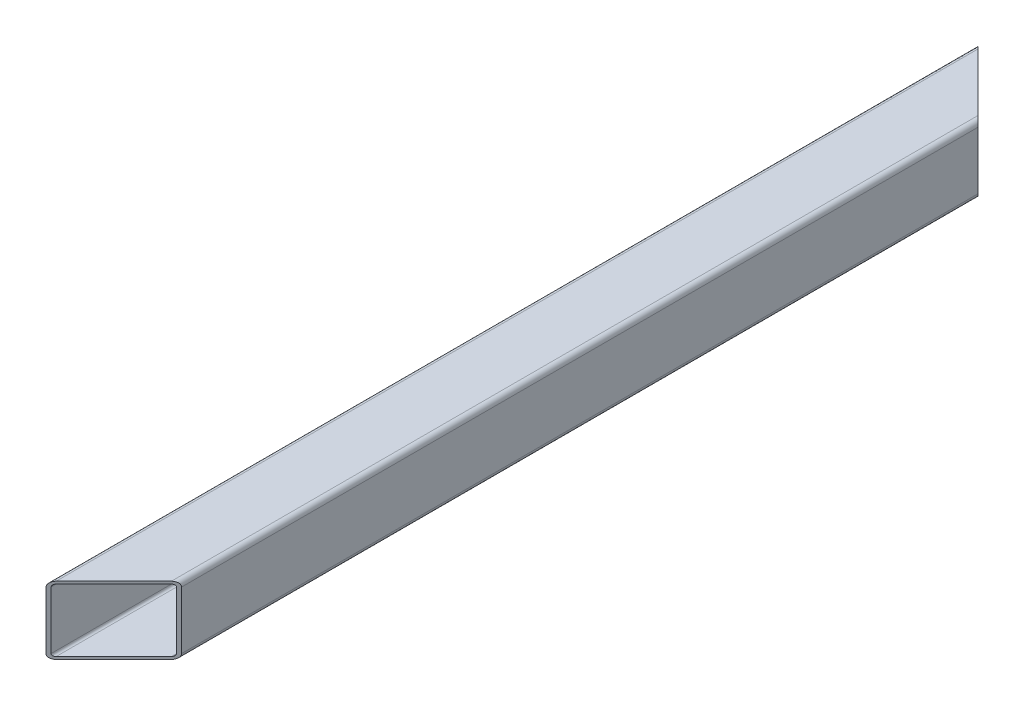
ISO-10303-21;
HEADER;
FILE_DESCRIPTION(('STEP AP214'),'2;1');
FILE_NAME('part.step','',(''),(''),'','','');
FILE_SCHEMA(('AUTOMOTIVE_DESIGN { 1 0 10303 214 1 1 1 1 }'));
ENDSEC;
DATA;
#1=APPLICATION_CONTEXT('core data for automotive mechanical design processes');
#2=APPLICATION_PROTOCOL_DEFINITION('international standard','automotive_design',2000,#1);
#3=PRODUCT_CONTEXT('',#1,'mechanical');
#4=PRODUCT('Part','Part','',(#3));
#5=PRODUCT_RELATED_PRODUCT_CATEGORY('part','',(#4));
#6=PRODUCT_DEFINITION_FORMATION('','',#4);
#7=PRODUCT_DEFINITION_CONTEXT('part definition',#1,'design');
#8=PRODUCT_DEFINITION('design','',#6,#7);
#9=PRODUCT_DEFINITION_SHAPE('','',#8);
#10=(LENGTH_UNIT() NAMED_UNIT(*) SI_UNIT(.MILLI.,.METRE.));
#11=(NAMED_UNIT(*) PLANE_ANGLE_UNIT() SI_UNIT($,.RADIAN.));
#12=(NAMED_UNIT(*) SI_UNIT($,.STERADIAN.) SOLID_ANGLE_UNIT());
#13=UNCERTAINTY_MEASURE_WITH_UNIT(LENGTH_MEASURE(1.E-05),#10,'distance_accuracy_value','');
#14=(GEOMETRIC_REPRESENTATION_CONTEXT(3) GLOBAL_UNCERTAINTY_ASSIGNED_CONTEXT((#13)) GLOBAL_UNIT_ASSIGNED_CONTEXT((#10,
#11,#12)) REPRESENTATION_CONTEXT('',''));
#15=CARTESIAN_POINT('',(0.,0.,0.));
#16=DIRECTION('',(0.,0.,1.));
#17=DIRECTION('',(1.,0.,0.));
#18=AXIS2_PLACEMENT_3D('',#15,#16,#17);
#19=CARTESIAN_POINT('',(34.,34.,550.));
#20=DIRECTION('',(0.,0.,-1.));
#21=DIRECTION('',(-1.,0.,0.));
#22=AXIS2_PLACEMENT_3D('',#19,#20,#21);
#23=CYLINDRICAL_SURFACE('',#22,5.99999999999998);
#24=DIRECTION('',(0.,0.,-1.));
#25=VECTOR('',#24,1.);
#26=CARTESIAN_POINT('',(34.,40.,550.));
#27=LINE('',#26,#25);
#28=CARTESIAN_POINT('',(34.,40.,476.000000000001));
#29=VERTEX_POINT('',#28);
#30=CARTESIAN_POINT('',(34.0000000000001,40.,-476.000000000001));
#31=VERTEX_POINT('',#30);
#32=EDGE_CURVE('E159',#29,#31,#27,.T.);
#33=ORIENTED_EDGE('',*,*,#32,.F.);
#34=CARTESIAN_POINT('',(34.,34.,476.000000000001));
#35=DIRECTION('',(-0.707106781186544,0.,-0.707106781186551));
#36=DIRECTION('',(0.707106781186551,0.,-0.707106781186544));
#37=AXIS2_PLACEMENT_3D('',#34,#35,#36);
#38=ELLIPSE('',#37,8.4852813742385,5.99999999999998);
#39=CARTESIAN_POINT('',(40.,34.,470.000000000001));
#40=VERTEX_POINT('',#39);
#41=EDGE_CURVE('E143',#29,#40,#38,.T.);
#42=ORIENTED_EDGE('',*,*,#41,.T.);
#43=DIRECTION('',(0.,0.,-1.));
#44=VECTOR('',#43,1.);
#45=CARTESIAN_POINT('',(40.,34.,550.));
#46=LINE('',#45,#44);
#47=CARTESIAN_POINT('',(40.,34.,-470.000000000001));
#48=VERTEX_POINT('',#47);
#49=EDGE_CURVE('E182',#40,#48,#46,.T.);
#50=ORIENTED_EDGE('',*,*,#49,.T.);
#51=CARTESIAN_POINT('',(34.,34.,-476.000000000001));
#52=DIRECTION('',(-0.707106781186544,0.,0.707106781186551));
#53=DIRECTION('',(-0.707106781186551,0.,-0.707106781186544));
#54=AXIS2_PLACEMENT_3D('',#51,#52,#53);
#55=ELLIPSE('',#54,8.4852813742385,5.99999999999998);
#56=EDGE_CURVE('E165',#48,#31,#55,.T.);
#57=ORIENTED_EDGE('',*,*,#56,.T.);
#58=EDGE_LOOP('',(#33,#42,#50,#57));
#59=FACE_BOUND('',#58,.T.);
#60=ADVANCED_FACE('F34',(#59),#23,.T.);
#61=CARTESIAN_POINT('',(-34.,40.,550.));
#62=DIRECTION('',(0.,-1.,0.));
#63=DIRECTION('',(0.,0.,-1.));
#64=AXIS2_PLACEMENT_3D('',#61,#62,#63);
#65=PLANE('',#64);
#66=DIRECTION('',(0.,0.,-1.));
#67=VECTOR('',#66,1.);
#68=CARTESIAN_POINT('',(-34.,40.,550.));
#69=LINE('',#68,#67);
#70=CARTESIAN_POINT('',(-34.,40.,544.));
#71=VERTEX_POINT('',#70);
#72=CARTESIAN_POINT('',(-34.,40.,-544.));
#73=VERTEX_POINT('',#72);
#74=EDGE_CURVE('E161',#71,#73,#69,.T.);
#75=ORIENTED_EDGE('',*,*,#74,.F.);
#76=DIRECTION('',(-0.707106781186551,0.,0.707106781186544));
#77=VECTOR('',#76,1.);
#78=CARTESIAN_POINT('',(40.,40.,470.000000000001));
#79=LINE('',#78,#77);
#80=EDGE_CURVE('E146',#29,#71,#79,.T.);
#81=ORIENTED_EDGE('',*,*,#80,.F.);
#82=ORIENTED_EDGE('',*,*,#32,.T.);
#83=DIRECTION('',(0.707106781186551,0.,0.707106781186544));
#84=VECTOR('',#83,1.);
#85=CARTESIAN_POINT('',(40.,40.,-470.000000000001));
#86=LINE('',#85,#84);
#87=EDGE_CURVE('E152',#73,#31,#86,.T.);
#88=ORIENTED_EDGE('',*,*,#87,.F.);
#89=EDGE_LOOP('',(#75,#81,#82,#88));
#90=FACE_BOUND('',#89,.T.);
#91=ADVANCED_FACE('F157',(#90),#65,.F.);
#92=CARTESIAN_POINT('',(-34.,34.,550.));
#93=DIRECTION('',(0.,0.,-1.));
#94=DIRECTION('',(-1.,0.,0.));
#95=AXIS2_PLACEMENT_3D('',#92,#93,#94);
#96=CYLINDRICAL_SURFACE('',#95,5.99999999999998);
#97=DIRECTION('',(0.,0.,-1.));
#98=VECTOR('',#97,1.);
#99=CARTESIAN_POINT('',(-40.,34.,550.));
#100=LINE('',#99,#98);
#101=CARTESIAN_POINT('',(-40.,34.,550.));
#102=VERTEX_POINT('',#101);
#103=CARTESIAN_POINT('',(-40.,34.,-550.));
#104=VERTEX_POINT('',#103);
#105=EDGE_CURVE('E168',#102,#104,#100,.T.);
#106=ORIENTED_EDGE('',*,*,#105,.F.);
#107=CARTESIAN_POINT('',(-34.,34.,544.));
#108=DIRECTION('',(-0.707106781186544,0.,-0.707106781186551));
#109=DIRECTION('',(0.707106781186551,0.,-0.707106781186544));
#110=AXIS2_PLACEMENT_3D('',#107,#108,#109);
#111=ELLIPSE('',#110,8.4852813742385,5.99999999999998);
#112=EDGE_CURVE('E153',#102,#71,#111,.T.);
#113=ORIENTED_EDGE('',*,*,#112,.T.);
#114=ORIENTED_EDGE('',*,*,#74,.T.);
#115=CARTESIAN_POINT('',(-34.,34.,-544.));
#116=DIRECTION('',(-0.707106781186544,0.,0.707106781186551));
#117=DIRECTION('',(-0.707106781186551,0.,-0.707106781186544));
#118=AXIS2_PLACEMENT_3D('',#115,#116,#117);
#119=ELLIPSE('',#118,8.4852813742385,5.99999999999998);
#120=EDGE_CURVE('E206',#73,#104,#119,.T.);
#121=ORIENTED_EDGE('',*,*,#120,.T.);
#122=EDGE_LOOP('',(#106,#113,#114,#121));
#123=FACE_BOUND('',#122,.T.);
#124=ADVANCED_FACE('F317',(#123),#96,.T.);
#125=CARTESIAN_POINT('',(-40.,34.,550.));
#126=DIRECTION('',(1.,0.,0.));
#127=DIRECTION('',(0.,0.,-1.));
#128=AXIS2_PLACEMENT_3D('',#125,#126,#127);
#129=PLANE('',#128);
#130=DIRECTION('',(0.,-1.,0.));
#131=VECTOR('',#130,1.);
#132=CARTESIAN_POINT('',(-40.,34.,-550.));
#133=LINE('',#132,#131);
#134=CARTESIAN_POINT('',(-40.,-34.,-550.));
#135=VERTEX_POINT('',#134);
#136=EDGE_CURVE('E185',#104,#135,#133,.T.);
#137=ORIENTED_EDGE('',*,*,#136,.T.);
#138=DIRECTION('',(0.,0.,-1.));
#139=VECTOR('',#138,1.);
#140=CARTESIAN_POINT('',(-40.,-34.,550.));
#141=LINE('',#140,#139);
#142=CARTESIAN_POINT('',(-40.,-34.,550.));
#143=VERTEX_POINT('',#142);
#144=EDGE_CURVE('E173',#143,#135,#141,.T.);
#145=ORIENTED_EDGE('',*,*,#144,.F.);
#146=DIRECTION('',(0.,-1.,0.));
#147=VECTOR('',#146,1.);
#148=CARTESIAN_POINT('',(-40.,34.,550.));
#149=LINE('',#148,#147);
#150=EDGE_CURVE('E184',#102,#143,#149,.T.);
#151=ORIENTED_EDGE('',*,*,#150,.F.);
#152=ORIENTED_EDGE('',*,*,#105,.T.);
#153=EDGE_LOOP('',(#137,#145,#151,#152));
#154=FACE_BOUND('',#153,.T.);
#155=ADVANCED_FACE('F321',(#154),#129,.F.);
#156=CARTESIAN_POINT('',(-34.,-34.,550.));
#157=DIRECTION('',(0.,0.,-1.));
#158=DIRECTION('',(-1.,0.,0.));
#159=AXIS2_PLACEMENT_3D('',#156,#157,#158);
#160=CYLINDRICAL_SURFACE('',#159,5.99999999999998);
#161=DIRECTION('',(0.,0.,-1.));
#162=VECTOR('',#161,1.);
#163=CARTESIAN_POINT('',(-34.,-40.,550.));
#164=LINE('',#163,#162);
#165=CARTESIAN_POINT('',(-34.,-40.,544.));
#166=VERTEX_POINT('',#165);
#167=CARTESIAN_POINT('',(-34.0000000000001,-40.,-544.));
#168=VERTEX_POINT('',#167);
#169=EDGE_CURVE('E176',#166,#168,#164,.T.);
#170=ORIENTED_EDGE('',*,*,#169,.F.);
#171=CARTESIAN_POINT('',(-34.,-34.,544.));
#172=DIRECTION('',(-0.707106781186544,0.,-0.707106781186551));
#173=DIRECTION('',(0.707106781186551,0.,-0.707106781186544));
#174=AXIS2_PLACEMENT_3D('',#171,#172,#173);
#175=ELLIPSE('',#174,8.4852813742385,5.99999999999998);
#176=EDGE_CURVE('E244',#166,#143,#175,.T.);
#177=ORIENTED_EDGE('',*,*,#176,.T.);
#178=ORIENTED_EDGE('',*,*,#144,.T.);
#179=CARTESIAN_POINT('',(-34.,-34.,-544.));
#180=DIRECTION('',(-0.707106781186544,0.,0.707106781186551));
#181=DIRECTION('',(-0.707106781186551,0.,-0.707106781186544));
#182=AXIS2_PLACEMENT_3D('',#179,#180,#181);
#183=ELLIPSE('',#182,8.4852813742385,5.99999999999998);
#184=EDGE_CURVE('E209',#135,#168,#183,.T.);
#185=ORIENTED_EDGE('',*,*,#184,.T.);
#186=EDGE_LOOP('',(#170,#177,#178,#185));
#187=FACE_BOUND('',#186,.T.);
#188=ADVANCED_FACE('F327',(#187),#160,.T.);
#189=CARTESIAN_POINT('',(-34.,-40.,550.));
#190=DIRECTION('',(0.,1.,0.));
#191=DIRECTION('',(0.,0.,1.));
#192=AXIS2_PLACEMENT_3D('',#189,#190,#191);
#193=PLANE('',#192);
#194=DIRECTION('',(0.,0.,-1.));
#195=VECTOR('',#194,1.);
#196=CARTESIAN_POINT('',(34.,-40.,550.));
#197=LINE('',#196,#195);
#198=CARTESIAN_POINT('',(34.,-40.,476.000000000001));
#199=VERTEX_POINT('',#198);
#200=CARTESIAN_POINT('',(34.,-40.,-476.000000000001));
#201=VERTEX_POINT('',#200);
#202=EDGE_CURVE('E178',#199,#201,#197,.T.);
#203=ORIENTED_EDGE('',*,*,#202,.F.);
#204=DIRECTION('',(-0.707106781186551,0.,0.707106781186544));
#205=VECTOR('',#204,1.);
#206=CARTESIAN_POINT('',(-37.,-40.,547.));
#207=LINE('',#206,#205);
#208=EDGE_CURVE('E247',#199,#166,#207,.T.);
#209=ORIENTED_EDGE('',*,*,#208,.T.);
#210=ORIENTED_EDGE('',*,*,#169,.T.);
#211=DIRECTION('',(0.707106781186551,0.,0.707106781186544));
#212=VECTOR('',#211,1.);
#213=CARTESIAN_POINT('',(513.,-40.,2.99999999999423));
#214=LINE('',#213,#212);
#215=EDGE_CURVE('E212',#168,#201,#214,.T.);
#216=ORIENTED_EDGE('',*,*,#215,.T.);
#217=EDGE_LOOP('',(#203,#209,#210,#216));
#218=FACE_BOUND('',#217,.T.);
#219=ADVANCED_FACE('F331',(#218),#193,.F.);
#220=CARTESIAN_POINT('',(34.,-34.,550.));
#221=DIRECTION('',(0.,0.,-1.));
#222=DIRECTION('',(-1.,0.,0.));
#223=AXIS2_PLACEMENT_3D('',#220,#221,#222);
#224=CYLINDRICAL_SURFACE('',#223,5.99999999999998);
#225=DIRECTION('',(0.,0.,-1.));
#226=VECTOR('',#225,1.);
#227=CARTESIAN_POINT('',(40.,-34.,550.));
#228=LINE('',#227,#226);
#229=CARTESIAN_POINT('',(40.,-34.,470.000000000001));
#230=VERTEX_POINT('',#229);
#231=CARTESIAN_POINT('',(40.,-34.,-470.000000000001));
#232=VERTEX_POINT('',#231);
#233=EDGE_CURVE('E180',#230,#232,#228,.T.);
#234=ORIENTED_EDGE('',*,*,#233,.F.);
#235=CARTESIAN_POINT('',(34.,-34.,476.000000000001));
#236=DIRECTION('',(-0.707106781186544,0.,-0.707106781186551));
#237=DIRECTION('',(0.707106781186551,0.,-0.707106781186544));
#238=AXIS2_PLACEMENT_3D('',#235,#236,#237);
#239=ELLIPSE('',#238,8.4852813742385,5.99999999999998);
#240=EDGE_CURVE('E48',#230,#199,#239,.T.);
#241=ORIENTED_EDGE('',*,*,#240,.T.);
#242=ORIENTED_EDGE('',*,*,#202,.T.);
#243=CARTESIAN_POINT('',(34.,-34.,-476.000000000001));
#244=DIRECTION('',(-0.707106781186544,0.,0.707106781186551));
#245=DIRECTION('',(-0.707106781186551,0.,-0.707106781186544));
#246=AXIS2_PLACEMENT_3D('',#243,#244,#245);
#247=ELLIPSE('',#246,8.4852813742385,5.99999999999998);
#248=EDGE_CURVE('E215',#201,#232,#247,.T.);
#249=ORIENTED_EDGE('',*,*,#248,.T.);
#250=EDGE_LOOP('',(#234,#241,#242,#249));
#251=FACE_BOUND('',#250,.T.);
#252=ADVANCED_FACE('F335',(#251),#224,.T.);
#253=CARTESIAN_POINT('',(40.,34.,550.));
#254=DIRECTION('',(-1.,0.,0.));
#255=DIRECTION('',(0.,0.,1.));
#256=AXIS2_PLACEMENT_3D('',#253,#254,#255);
#257=PLANE('',#256);
#258=ORIENTED_EDGE('',*,*,#49,.F.);
#259=DIRECTION('',(0.,1.,0.));
#260=VECTOR('',#259,1.);
#261=CARTESIAN_POINT('',(40.,-100.,470.000000000001));
#262=LINE('',#261,#260);
#263=EDGE_CURVE('E148',#230,#40,#262,.T.);
#264=ORIENTED_EDGE('',*,*,#263,.F.);
#265=ORIENTED_EDGE('',*,*,#233,.T.);
#266=DIRECTION('',(0.,1.,0.));
#267=VECTOR('',#266,1.);
#268=CARTESIAN_POINT('',(40.,-100.,-470.000000000001));
#269=LINE('',#268,#267);
#270=EDGE_CURVE('E239',#232,#48,#269,.T.);
#271=ORIENTED_EDGE('',*,*,#270,.T.);
#272=EDGE_LOOP('',(#258,#264,#265,#271));
#273=FACE_BOUND('',#272,.T.);
#274=ADVANCED_FACE('F339',(#273),#257,.F.);
#275=CARTESIAN_POINT('',(-34.,34.,550.));
#276=DIRECTION('',(0.,0.,-1.));
#277=DIRECTION('',(-1.,0.,0.));
#278=AXIS2_PLACEMENT_3D('',#275,#276,#277);
#279=CYLINDRICAL_SURFACE('',#278,3.);
#280=CARTESIAN_POINT('',(-34.,34.,544.));
#281=DIRECTION('',(-0.707106781186544,0.,-0.707106781186551));
#282=DIRECTION('',(0.707106781186551,0.,-0.707106781186544));
#283=AXIS2_PLACEMENT_3D('',#280,#281,#282);
#284=ELLIPSE('',#283,4.24264068711926,3.);
#285=CARTESIAN_POINT('',(-37.,34.,547.));
#286=VERTEX_POINT('',#285);
#287=CARTESIAN_POINT('',(-34.,37.,544.));
#288=VERTEX_POINT('',#287);
#289=EDGE_CURVE('E55',#286,#288,#284,.T.);
#290=ORIENTED_EDGE('',*,*,#289,.F.);
#291=DIRECTION('',(0.,0.,-1.));
#292=VECTOR('',#291,1.);
#293=CARTESIAN_POINT('',(-37.,34.,550.));
#294=LINE('',#293,#292);
#295=CARTESIAN_POINT('',(-37.,34.,-547.));
#296=VERTEX_POINT('',#295);
#297=EDGE_CURVE('E188',#286,#296,#294,.T.);
#298=ORIENTED_EDGE('',*,*,#297,.T.);
#299=CARTESIAN_POINT('',(-34.,34.,-544.));
#300=DIRECTION('',(-0.707106781186544,0.,0.707106781186551));
#301=DIRECTION('',(-0.707106781186551,0.,-0.707106781186544));
#302=AXIS2_PLACEMENT_3D('',#299,#300,#301);
#303=ELLIPSE('',#302,4.24264068711926,3.);
#304=CARTESIAN_POINT('',(-34.0000000000001,37.,-544.));
#305=VERTEX_POINT('',#304);
#306=EDGE_CURVE('E218',#305,#296,#303,.T.);
#307=ORIENTED_EDGE('',*,*,#306,.F.);
#308=DIRECTION('',(0.,0.,-1.));
#309=VECTOR('',#308,1.);
#310=CARTESIAN_POINT('',(-34.,37.,550.));
#311=LINE('',#310,#309);
#312=EDGE_CURVE('E203',#288,#305,#311,.T.);
#313=ORIENTED_EDGE('',*,*,#312,.F.);
#314=EDGE_LOOP('',(#290,#298,#307,#313));
#315=FACE_BOUND('',#314,.T.);
#316=ADVANCED_FACE('F285',(#315),#279,.F.);
#317=CARTESIAN_POINT('',(-37.,34.,550.));
#318=DIRECTION('',(1.,0.,0.));
#319=DIRECTION('',(0.,1.,0.));
#320=AXIS2_PLACEMENT_3D('',#317,#318,#319);
#321=PLANE('',#320);
#322=DIRECTION('',(0.,1.,0.));
#323=VECTOR('',#322,1.);
#324=CARTESIAN_POINT('',(-37.,34.,547.));
#325=LINE('',#324,#323);
#326=CARTESIAN_POINT('',(-37.,-34.,547.));
#327=VERTEX_POINT('',#326);
#328=EDGE_CURVE('E252',#327,#286,#325,.T.);
#329=ORIENTED_EDGE('',*,*,#328,.F.);
#330=DIRECTION('',(0.,0.,-1.));
#331=VECTOR('',#330,1.);
#332=CARTESIAN_POINT('',(-37.,-34.,550.));
#333=LINE('',#332,#331);
#334=CARTESIAN_POINT('',(-37.,-34.,-547.));
#335=VERTEX_POINT('',#334);
#336=EDGE_CURVE('E191',#327,#335,#333,.T.);
#337=ORIENTED_EDGE('',*,*,#336,.T.);
#338=DIRECTION('',(0.,-1.,0.));
#339=VECTOR('',#338,1.);
#340=CARTESIAN_POINT('',(-37.,34.0000000000001,-547.));
#341=LINE('',#340,#339);
#342=EDGE_CURVE('E221',#296,#335,#341,.T.);
#343=ORIENTED_EDGE('',*,*,#342,.F.);
#344=ORIENTED_EDGE('',*,*,#297,.F.);
#345=EDGE_LOOP('',(#329,#337,#343,#344));
#346=FACE_BOUND('',#345,.T.);
#347=ADVANCED_FACE('F291',(#346),#321,.T.);
#348=CARTESIAN_POINT('',(-34.,-34.,550.));
#349=DIRECTION('',(0.,0.,-1.));
#350=DIRECTION('',(-1.,0.,0.));
#351=AXIS2_PLACEMENT_3D('',#348,#349,#350);
#352=CYLINDRICAL_SURFACE('',#351,3.);
#353=CARTESIAN_POINT('',(-34.,-34.,544.));
#354=DIRECTION('',(-0.707106781186544,0.,-0.707106781186551));
#355=DIRECTION('',(0.707106781186551,0.,-0.707106781186544));
#356=AXIS2_PLACEMENT_3D('',#353,#354,#355);
#357=ELLIPSE('',#356,4.24264068711927,3.);
#358=CARTESIAN_POINT('',(-34.,-37.,544.));
#359=VERTEX_POINT('',#358);
#360=EDGE_CURVE('E254',#359,#327,#357,.T.);
#361=ORIENTED_EDGE('',*,*,#360,.F.);
#362=DIRECTION('',(0.,0.,-1.));
#363=VECTOR('',#362,1.);
#364=CARTESIAN_POINT('',(-34.,-37.,550.));
#365=LINE('',#364,#363);
#366=CARTESIAN_POINT('',(-34.0000000000001,-37.,-544.));
#367=VERTEX_POINT('',#366);
#368=EDGE_CURVE('E193',#359,#367,#365,.T.);
#369=ORIENTED_EDGE('',*,*,#368,.T.);
#370=CARTESIAN_POINT('',(-34.,-34.,-544.));
#371=DIRECTION('',(-0.707106781186544,0.,0.707106781186551));
#372=DIRECTION('',(-0.707106781186551,0.,-0.707106781186544));
#373=AXIS2_PLACEMENT_3D('',#370,#371,#372);
#374=ELLIPSE('',#373,4.24264068711927,3.);
#375=EDGE_CURVE('E224',#335,#367,#374,.T.);
#376=ORIENTED_EDGE('',*,*,#375,.F.);
#377=ORIENTED_EDGE('',*,*,#336,.F.);
#378=EDGE_LOOP('',(#361,#369,#376,#377));
#379=FACE_BOUND('',#378,.T.);
#380=ADVANCED_FACE('F295',(#379),#352,.F.);
#381=CARTESIAN_POINT('',(-34.,-37.,550.));
#382=DIRECTION('',(0.,1.,0.));
#383=DIRECTION('',(-1.,0.,0.));
#384=AXIS2_PLACEMENT_3D('',#381,#382,#383);
#385=PLANE('',#384);
#386=DIRECTION('',(-0.707106781186551,0.,0.707106781186544));
#387=VECTOR('',#386,1.);
#388=CARTESIAN_POINT('',(-37.,-37.,547.));
#389=LINE('',#388,#387);
#390=CARTESIAN_POINT('',(34.,-37.,476.000000000001));
#391=VERTEX_POINT('',#390);
#392=EDGE_CURVE('E256',#391,#359,#389,.T.);
#393=ORIENTED_EDGE('',*,*,#392,.F.);
#394=DIRECTION('',(0.,0.,-1.));
#395=VECTOR('',#394,1.);
#396=CARTESIAN_POINT('',(34.,-37.,550.));
#397=LINE('',#396,#395);
#398=CARTESIAN_POINT('',(34.,-37.,-476.000000000001));
#399=VERTEX_POINT('',#398);
#400=EDGE_CURVE('E195',#391,#399,#397,.T.);
#401=ORIENTED_EDGE('',*,*,#400,.T.);
#402=DIRECTION('',(0.707106781186551,0.,0.707106781186544));
#403=VECTOR('',#402,1.);
#404=CARTESIAN_POINT('',(513.,-37.,2.99999999999423));
#405=LINE('',#404,#403);
#406=EDGE_CURVE('E227',#367,#399,#405,.T.);
#407=ORIENTED_EDGE('',*,*,#406,.F.);
#408=ORIENTED_EDGE('',*,*,#368,.F.);
#409=EDGE_LOOP('',(#393,#401,#407,#408));
#410=FACE_BOUND('',#409,.T.);
#411=ADVANCED_FACE('F301',(#410),#385,.T.);
#412=CARTESIAN_POINT('',(34.,-34.,550.));
#413=DIRECTION('',(0.,0.,-1.));
#414=DIRECTION('',(-1.,0.,0.));
#415=AXIS2_PLACEMENT_3D('',#412,#413,#414);
#416=CYLINDRICAL_SURFACE('',#415,3.);
#417=CARTESIAN_POINT('',(34.,-34.,476.000000000001));
#418=DIRECTION('',(-0.707106781186544,0.,-0.707106781186551));
#419=DIRECTION('',(0.707106781186551,0.,-0.707106781186544));
#420=AXIS2_PLACEMENT_3D('',#417,#418,#419);
#421=ELLIPSE('',#420,4.24264068711926,3.);
#422=CARTESIAN_POINT('',(37.,-34.,473.000000000001));
#423=VERTEX_POINT('',#422);
#424=EDGE_CURVE('E258',#423,#391,#421,.T.);
#425=ORIENTED_EDGE('',*,*,#424,.F.);
#426=DIRECTION('',(0.,0.,-1.));
#427=VECTOR('',#426,1.);
#428=CARTESIAN_POINT('',(37.,-34.,550.));
#429=LINE('',#428,#427);
#430=CARTESIAN_POINT('',(37.,-34.,-473.000000000001));
#431=VERTEX_POINT('',#430);
#432=EDGE_CURVE('E197',#423,#431,#429,.T.);
#433=ORIENTED_EDGE('',*,*,#432,.T.);
#434=CARTESIAN_POINT('',(34.,-34.,-476.000000000001));
#435=DIRECTION('',(-0.707106781186544,0.,0.707106781186551));
#436=DIRECTION('',(-0.707106781186551,0.,-0.707106781186544));
#437=AXIS2_PLACEMENT_3D('',#434,#435,#436);
#438=ELLIPSE('',#437,4.24264068711926,3.);
#439=EDGE_CURVE('E230',#399,#431,#438,.T.);
#440=ORIENTED_EDGE('',*,*,#439,.F.);
#441=ORIENTED_EDGE('',*,*,#400,.F.);
#442=EDGE_LOOP('',(#425,#433,#440,#441));
#443=FACE_BOUND('',#442,.T.);
#444=ADVANCED_FACE('F304',(#443),#416,.F.);
#445=CARTESIAN_POINT('',(37.,34.,550.));
#446=DIRECTION('',(-1.,0.,0.));
#447=DIRECTION('',(0.,-1.,0.));
#448=AXIS2_PLACEMENT_3D('',#445,#446,#447);
#449=PLANE('',#448);
#450=DIRECTION('',(0.,-1.,0.));
#451=VECTOR('',#450,1.);
#452=CARTESIAN_POINT('',(37.,34.,473.000000000001));
#453=LINE('',#452,#451);
#454=CARTESIAN_POINT('',(37.,34.,473.000000000001));
#455=VERTEX_POINT('',#454);
#456=EDGE_CURVE('E260',#455,#423,#453,.T.);
#457=ORIENTED_EDGE('',*,*,#456,.F.);
#458=DIRECTION('',(0.,0.,-1.));
#459=VECTOR('',#458,1.);
#460=CARTESIAN_POINT('',(37.,34.,550.));
#461=LINE('',#460,#459);
#462=CARTESIAN_POINT('',(37.,34.,-473.000000000001));
#463=VERTEX_POINT('',#462);
#464=EDGE_CURVE('E199',#455,#463,#461,.T.);
#465=ORIENTED_EDGE('',*,*,#464,.T.);
#466=DIRECTION('',(0.,1.,0.));
#467=VECTOR('',#466,1.);
#468=CARTESIAN_POINT('',(37.,33.9999999999999,-473.000000000001));
#469=LINE('',#468,#467);
#470=EDGE_CURVE('E233',#431,#463,#469,.T.);
#471=ORIENTED_EDGE('',*,*,#470,.F.);
#472=ORIENTED_EDGE('',*,*,#432,.F.);
#473=EDGE_LOOP('',(#457,#465,#471,#472));
#474=FACE_BOUND('',#473,.T.);
#475=ADVANCED_FACE('F272',(#474),#449,.T.);
#476=CARTESIAN_POINT('',(34.,34.,550.));
#477=DIRECTION('',(0.,0.,-1.));
#478=DIRECTION('',(-1.,0.,0.));
#479=AXIS2_PLACEMENT_3D('',#476,#477,#478);
#480=CYLINDRICAL_SURFACE('',#479,3.);
#481=CARTESIAN_POINT('',(34.,34.,476.000000000001));
#482=DIRECTION('',(-0.707106781186544,0.,-0.707106781186551));
#483=DIRECTION('',(0.707106781186551,0.,-0.707106781186544));
#484=AXIS2_PLACEMENT_3D('',#481,#482,#483);
#485=ELLIPSE('',#484,4.24264068711926,3.);
#486=CARTESIAN_POINT('',(34.,37.,476.000000000001));
#487=VERTEX_POINT('',#486);
#488=EDGE_CURVE('E262',#487,#455,#485,.T.);
#489=ORIENTED_EDGE('',*,*,#488,.F.);
#490=DIRECTION('',(0.,0.,-1.));
#491=VECTOR('',#490,1.);
#492=CARTESIAN_POINT('',(34.,37.,550.));
#493=LINE('',#492,#491);
#494=CARTESIAN_POINT('',(34.,37.,-476.000000000001));
#495=VERTEX_POINT('',#494);
#496=EDGE_CURVE('E201',#487,#495,#493,.T.);
#497=ORIENTED_EDGE('',*,*,#496,.T.);
#498=CARTESIAN_POINT('',(34.,34.,-476.000000000001));
#499=DIRECTION('',(-0.707106781186544,0.,0.707106781186551));
#500=DIRECTION('',(-0.707106781186551,0.,-0.707106781186544));
#501=AXIS2_PLACEMENT_3D('',#498,#499,#500);
#502=ELLIPSE('',#501,4.24264068711926,3.);
#503=EDGE_CURVE('E236',#463,#495,#502,.T.);
#504=ORIENTED_EDGE('',*,*,#503,.F.);
#505=ORIENTED_EDGE('',*,*,#464,.F.);
#506=EDGE_LOOP('',(#489,#497,#504,#505));
#507=FACE_BOUND('',#506,.T.);
#508=ADVANCED_FACE('F275',(#507),#480,.F.);
#509=CARTESIAN_POINT('',(-34.,37.,550.));
#510=DIRECTION('',(0.,-1.,0.));
#511=DIRECTION('',(1.,0.,0.));
#512=AXIS2_PLACEMENT_3D('',#509,#510,#511);
#513=PLANE('',#512);
#514=DIRECTION('',(0.707106781186551,0.,-0.707106781186544));
#515=VECTOR('',#514,1.);
#516=CARTESIAN_POINT('',(-37.,37.,547.));
#517=LINE('',#516,#515);
#518=EDGE_CURVE('E11',#288,#487,#517,.T.);
#519=ORIENTED_EDGE('',*,*,#518,.F.);
#520=ORIENTED_EDGE('',*,*,#312,.T.);
#521=DIRECTION('',(-0.707106781186551,0.,-0.707106781186544));
#522=VECTOR('',#521,1.);
#523=CARTESIAN_POINT('',(513.,37.0000000000001,2.99999999999423));
#524=LINE('',#523,#522);
#525=EDGE_CURVE('E41',#495,#305,#524,.T.);
#526=ORIENTED_EDGE('',*,*,#525,.F.);
#527=ORIENTED_EDGE('',*,*,#496,.F.);
#528=EDGE_LOOP('',(#519,#520,#526,#527));
#529=FACE_BOUND('',#528,.T.);
#530=ADVANCED_FACE('F282',(#529),#513,.T.);
#531=CARTESIAN_POINT('',(40.,-100.,-470.000000000001));
#532=DIRECTION('',(-0.707106781186544,0.,0.707106781186551));
#533=DIRECTION('',(0.707106781186551,0.,0.707106781186544));
#534=AXIS2_PLACEMENT_3D('',#531,#532,#533);
#535=PLANE('',#534);
#536=ORIENTED_EDGE('',*,*,#306,.T.);
#537=ORIENTED_EDGE('',*,*,#342,.T.);
#538=ORIENTED_EDGE('',*,*,#375,.T.);
#539=ORIENTED_EDGE('',*,*,#406,.T.);
#540=ORIENTED_EDGE('',*,*,#439,.T.);
#541=ORIENTED_EDGE('',*,*,#470,.T.);
#542=ORIENTED_EDGE('',*,*,#503,.T.);
#543=ORIENTED_EDGE('',*,*,#525,.T.);
#544=EDGE_LOOP('',(#536,#537,#538,#539,#540,#541,#542,#543));
#545=FACE_BOUND('',#544,.T.);
#546=ORIENTED_EDGE('',*,*,#270,.F.);
#547=ORIENTED_EDGE('',*,*,#248,.F.);
#548=ORIENTED_EDGE('',*,*,#215,.F.);
#549=ORIENTED_EDGE('',*,*,#184,.F.);
#550=ORIENTED_EDGE('',*,*,#136,.F.);
#551=ORIENTED_EDGE('',*,*,#120,.F.);
#552=ORIENTED_EDGE('',*,*,#87,.T.);
#553=ORIENTED_EDGE('',*,*,#56,.F.);
#554=EDGE_LOOP('',(#546,#547,#548,#549,#550,#551,#552,#553));
#555=FACE_BOUND('',#554,.T.);
#556=ADVANCED_FACE('F278',(#545,#555),#535,.F.);
#557=CARTESIAN_POINT('',(40.,-100.,470.000000000001));
#558=DIRECTION('',(-0.707106781186544,0.,-0.707106781186551));
#559=DIRECTION('',(-0.707106781186551,0.,0.707106781186544));
#560=AXIS2_PLACEMENT_3D('',#557,#558,#559);
#561=PLANE('',#560);
#562=ORIENTED_EDGE('',*,*,#289,.T.);
#563=ORIENTED_EDGE('',*,*,#518,.T.);
#564=ORIENTED_EDGE('',*,*,#488,.T.);
#565=ORIENTED_EDGE('',*,*,#456,.T.);
#566=ORIENTED_EDGE('',*,*,#424,.T.);
#567=ORIENTED_EDGE('',*,*,#392,.T.);
#568=ORIENTED_EDGE('',*,*,#360,.T.);
#569=ORIENTED_EDGE('',*,*,#328,.T.);
#570=EDGE_LOOP('',(#562,#563,#564,#565,#566,#567,#568,#569));
#571=FACE_BOUND('',#570,.T.);
#572=ORIENTED_EDGE('',*,*,#80,.T.);
#573=ORIENTED_EDGE('',*,*,#112,.F.);
#574=ORIENTED_EDGE('',*,*,#150,.T.);
#575=ORIENTED_EDGE('',*,*,#176,.F.);
#576=ORIENTED_EDGE('',*,*,#208,.F.);
#577=ORIENTED_EDGE('',*,*,#240,.F.);
#578=ORIENTED_EDGE('',*,*,#263,.T.);
#579=ORIENTED_EDGE('',*,*,#41,.F.);
#580=EDGE_LOOP('',(#572,#573,#574,#575,#576,#577,#578,#579));
#581=FACE_BOUND('',#580,.T.);
#582=ADVANCED_FACE('F145',(#571,#581),#561,.F.);
#583=CLOSED_SHELL('',(#60,#91,#124,#155,#188,#219,#252,#274,#316,#347,#380,#411,#444,#475,#508,
#530,#556,#582));
#584=MANIFOLD_SOLID_BREP('B2',#583);
#585=ADVANCED_BREP_SHAPE_REPRESENTATION('',(#18,#584),#14);
#586=SHAPE_DEFINITION_REPRESENTATION(#9,#585);
ENDSEC;
END-ISO-10303-21;
